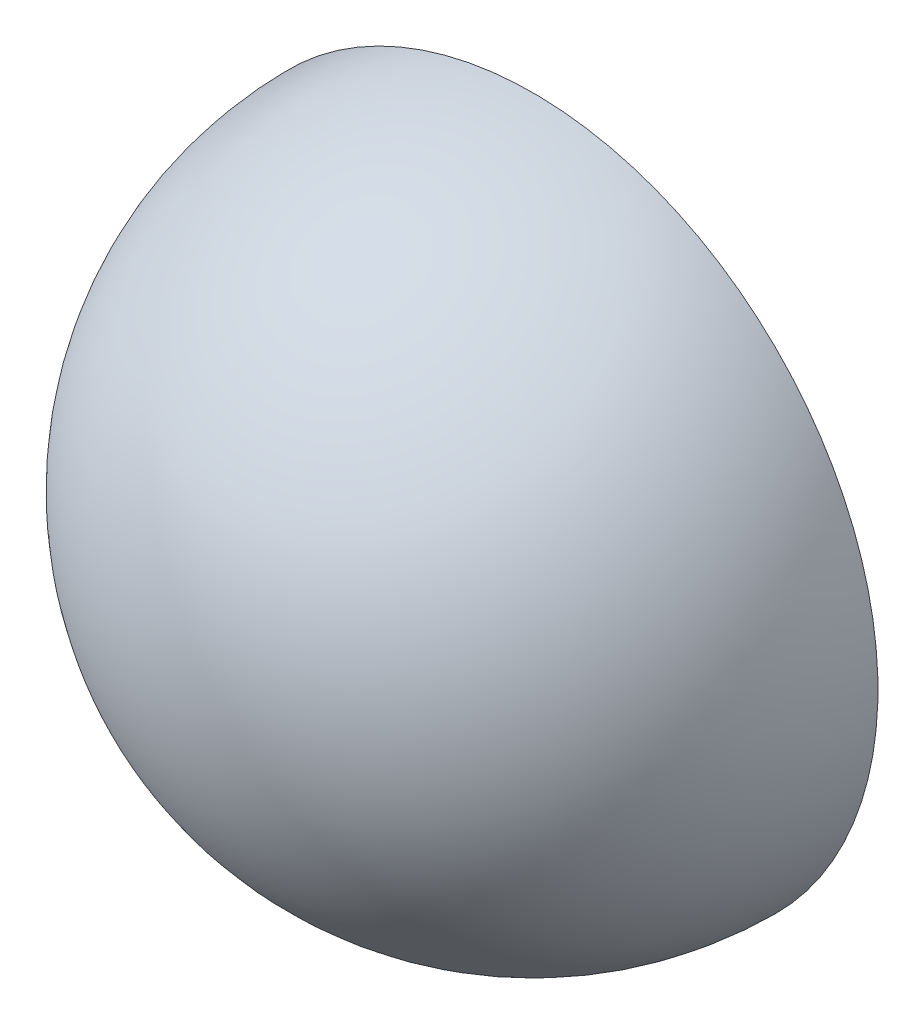
ISO-10303-21;
HEADER;
FILE_DESCRIPTION(('STEP AP214'),'2;1');
FILE_NAME('part.step','',(''),(''),'','','');
FILE_SCHEMA(('AUTOMOTIVE_DESIGN { 1 0 10303 214 1 1 1 1 }'));
ENDSEC;
DATA;
#1=APPLICATION_CONTEXT('core data for automotive mechanical design processes');
#2=APPLICATION_PROTOCOL_DEFINITION('international standard','automotive_design',2000,#1);
#3=PRODUCT_CONTEXT('',#1,'mechanical');
#4=PRODUCT('Part','Part','',(#3));
#5=PRODUCT_RELATED_PRODUCT_CATEGORY('part','',(#4));
#6=PRODUCT_DEFINITION_FORMATION('','',#4);
#7=PRODUCT_DEFINITION_CONTEXT('part definition',#1,'design');
#8=PRODUCT_DEFINITION('design','',#6,#7);
#9=PRODUCT_DEFINITION_SHAPE('','',#8);
#10=(LENGTH_UNIT() NAMED_UNIT(*) SI_UNIT(.MILLI.,.METRE.));
#11=(NAMED_UNIT(*) PLANE_ANGLE_UNIT() SI_UNIT($,.RADIAN.));
#12=(NAMED_UNIT(*) SI_UNIT($,.STERADIAN.) SOLID_ANGLE_UNIT());
#13=UNCERTAINTY_MEASURE_WITH_UNIT(LENGTH_MEASURE(1.E-05),#10,'distance_accuracy_value','');
#14=(GEOMETRIC_REPRESENTATION_CONTEXT(3) GLOBAL_UNCERTAINTY_ASSIGNED_CONTEXT((#13)) GLOBAL_UNIT_ASSIGNED_CONTEXT((#10,
#11,#12)) REPRESENTATION_CONTEXT('',''));
#15=CARTESIAN_POINT('',(0.,0.,0.));
#16=DIRECTION('',(0.,0.,1.));
#17=DIRECTION('',(1.,0.,0.));
#18=AXIS2_PLACEMENT_3D('',#15,#16,#17);
#19=CARTESIAN_POINT('',(1.944739117046E-13,0.,0.));
#20=DIRECTION('',(0.,1.,0.));
#21=DIRECTION('',(-1.,0.,0.));
#22=AXIS2_PLACEMENT_3D('',#19,#20,#21);
#23=SPHERICAL_SURFACE('',#22,433.);
#24=CARTESIAN_POINT('',(1.944739117046E-13,0.,0.));
#25=DIRECTION('',(0.,0.,-1.));
#26=DIRECTION('',(-1.,0.,0.));
#27=AXIS2_PLACEMENT_3D('',#24,#25,#26);
#28=SPHERICAL_SURFACE('',#27,433.);
#29=CARTESIAN_POINT('',(1.944739117046E-13,0.,0.));
#30=DIRECTION('',(0.,0.,-1.));
#31=DIRECTION('',(-1.,0.,0.));
#32=AXIS2_PLACEMENT_3D('',#29,#30,#31);
#33=CIRCLE('',#32,433.);
#34=CARTESIAN_POINT('',(-433.,0.,-3.02362283943815E-12));
#35=VERTEX_POINT('',#34);
#36=EDGE_CURVE('E47',#35,#35,#33,.T.);
#37=ORIENTED_EDGE('',*,*,#36,.T.);
#38=EDGE_LOOP('',(#37));
#39=FACE_BOUND('',#38,.T.);
#40=ADVANCED_FACE('F39',(#39),#28,.F.);
#41=CARTESIAN_POINT('',(1.944739117046E-13,0.,0.));
#42=DIRECTION('',(0.,1.,0.));
#43=DIRECTION('',(-1.,0.,0.));
#44=AXIS2_PLACEMENT_3D('',#41,#42,#43);
#45=SPHERICAL_SURFACE('',#44,436.);
#46=CARTESIAN_POINT('',(1.944739117046E-13,0.,0.));
#47=DIRECTION('',(0.,0.,-1.));
#48=DIRECTION('',(-1.,0.,0.));
#49=AXIS2_PLACEMENT_3D('',#46,#47,#48);
#50=SPHERICAL_SURFACE('',#49,436.);
#51=CARTESIAN_POINT('',(1.944739117046E-13,0.,0.));
#52=DIRECTION('',(0.,0.,-1.));
#53=DIRECTION('',(-1.,0.,0.));
#54=AXIS2_PLACEMENT_3D('',#51,#52,#53);
#55=CIRCLE('',#54,436.);
#56=CARTESIAN_POINT('',(-436.,0.,-3.04457172747121E-12));
#57=VERTEX_POINT('',#56);
#58=EDGE_CURVE('E10',#57,#57,#55,.T.);
#59=ORIENTED_EDGE('',*,*,#58,.F.);
#60=EDGE_LOOP('',(#59));
#61=FACE_BOUND('',#60,.T.);
#62=ADVANCED_FACE('F41',(#61),#50,.T.);
#63=CARTESIAN_POINT('',(1.944739117046E-13,0.,0.));
#64=DIRECTION('',(0.,0.,-1.));
#65=DIRECTION('',(-1.,0.,0.));
#66=AXIS2_PLACEMENT_3D('',#63,#64,#65);
#67=PLANE('',#66);
#68=ORIENTED_EDGE('',*,*,#58,.T.);
#69=EDGE_LOOP('',(#68));
#70=FACE_BOUND('',#69,.T.);
#71=ORIENTED_EDGE('',*,*,#36,.F.);
#72=EDGE_LOOP('',(#71));
#73=FACE_BOUND('',#72,.T.);
#74=ADVANCED_FACE('F55',(#70,#73),#67,.T.);
#75=CLOSED_SHELL('',(#40,#62,#74));
#76=MANIFOLD_SOLID_BREP('B2',#75);
#77=ADVANCED_BREP_SHAPE_REPRESENTATION('',(#18,#76),#14);
#78=SHAPE_DEFINITION_REPRESENTATION(#9,#77);
ENDSEC;
END-ISO-10303-21;
